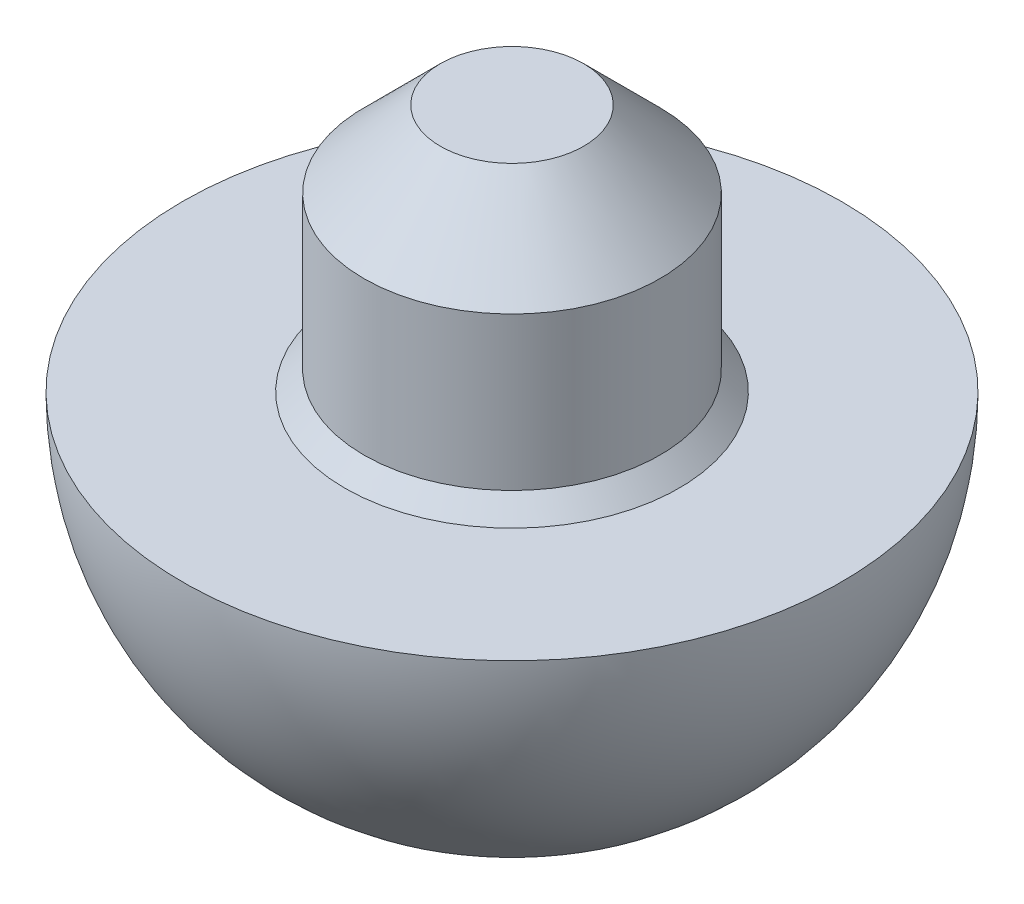
ISO-10303-21;
HEADER;
FILE_DESCRIPTION(('STEP AP214'),'2;1');
FILE_NAME('part.step','',(''),(''),'','','');
FILE_SCHEMA(('AUTOMOTIVE_DESIGN { 1 0 10303 214 1 1 1 1 }'));
ENDSEC;
DATA;
#1=APPLICATION_CONTEXT('core data for automotive mechanical design processes');
#2=APPLICATION_PROTOCOL_DEFINITION('international standard','automotive_design',2000,#1);
#3=PRODUCT_CONTEXT('',#1,'mechanical');
#4=PRODUCT('Part','Part','',(#3));
#5=PRODUCT_RELATED_PRODUCT_CATEGORY('part','',(#4));
#6=PRODUCT_DEFINITION_FORMATION('','',#4);
#7=PRODUCT_DEFINITION_CONTEXT('part definition',#1,'design');
#8=PRODUCT_DEFINITION('design','',#6,#7);
#9=PRODUCT_DEFINITION_SHAPE('','',#8);
#10=(LENGTH_UNIT() NAMED_UNIT(*) SI_UNIT(.MILLI.,.METRE.));
#11=(NAMED_UNIT(*) PLANE_ANGLE_UNIT() SI_UNIT($,.RADIAN.));
#12=(NAMED_UNIT(*) SI_UNIT($,.STERADIAN.) SOLID_ANGLE_UNIT());
#13=UNCERTAINTY_MEASURE_WITH_UNIT(LENGTH_MEASURE(1.E-05),#10,'distance_accuracy_value','');
#14=(GEOMETRIC_REPRESENTATION_CONTEXT(3) GLOBAL_UNCERTAINTY_ASSIGNED_CONTEXT((#13)) GLOBAL_UNIT_ASSIGNED_CONTEXT((#10,
#11,#12)) REPRESENTATION_CONTEXT('',''));
#15=CARTESIAN_POINT('',(0.,0.,0.));
#16=DIRECTION('',(0.,0.,1.));
#17=DIRECTION('',(1.,0.,0.));
#18=AXIS2_PLACEMENT_3D('',#15,#16,#17);
#19=CARTESIAN_POINT('',(0.,16.75,0.));
#20=DIRECTION('',(0.,-1.,0.));
#21=DIRECTION('',(0.,0.,-1.));
#22=AXIS2_PLACEMENT_3D('',#19,#20,#21);
#23=CONICAL_SURFACE('',#22,0.,0.78539816339745);
#24=CARTESIAN_POINT('',(0.,13.,0.));
#25=DIRECTION('',(0.,1.,0.));
#26=DIRECTION('',(-1.,0.,0.));
#27=AXIS2_PLACEMENT_3D('',#24,#25,#26);
#28=CIRCLE('',#27,3.75000000000004);
#29=CARTESIAN_POINT('',(-3.75000000000004,13.,0.));
#30=VERTEX_POINT('',#29);
#31=EDGE_CURVE('E42',#30,#30,#28,.T.);
#32=ORIENTED_EDGE('',*,*,#31,.F.);
#33=EDGE_LOOP('',(#32));
#34=FACE_BOUND('',#33,.T.);
#35=CARTESIAN_POINT('',(0.,9.,0.));
#36=DIRECTION('',(0.,-1.,0.));
#37=DIRECTION('',(0.,0.,-1.));
#38=AXIS2_PLACEMENT_3D('',#35,#36,#37);
#39=CIRCLE('',#38,7.75);
#40=CARTESIAN_POINT('',(0.,9.,-7.75));
#41=VERTEX_POINT('',#40);
#42=EDGE_CURVE('E30',#41,#41,#39,.T.);
#43=ORIENTED_EDGE('',*,*,#42,.F.);
#44=EDGE_LOOP('',(#43));
#45=FACE_BOUND('',#44,.T.);
#46=ADVANCED_FACE('F15',(#34,#45),#23,.T.);
#47=CARTESIAN_POINT('',(0.,0.,0.));
#48=DIRECTION('',(0.,-1.,0.));
#49=DIRECTION('',(0.,0.,-1.));
#50=AXIS2_PLACEMENT_3D('',#47,#48,#49);
#51=CYLINDRICAL_SURFACE('',#50,7.75);
#52=CARTESIAN_POINT('',(0.,1.,0.));
#53=DIRECTION('',(0.,-1.,0.));
#54=DIRECTION('',(0.,0.,-1.));
#55=AXIS2_PLACEMENT_3D('',#52,#53,#54);
#56=CIRCLE('',#55,7.75);
#57=CARTESIAN_POINT('',(0.,1.,-7.75));
#58=VERTEX_POINT('',#57);
#59=EDGE_CURVE('E10',#58,#58,#56,.F.);
#60=ORIENTED_EDGE('',*,*,#59,.T.);
#61=EDGE_LOOP('',(#60));
#62=FACE_BOUND('',#61,.T.);
#63=ORIENTED_EDGE('',*,*,#42,.T.);
#64=EDGE_LOOP('',(#63));
#65=FACE_BOUND('',#64,.T.);
#66=ADVANCED_FACE('F69',(#62,#65),#51,.T.);
#67=CARTESIAN_POINT('',(-7.75,0.,0.));
#68=DIRECTION('',(0.,-1.,0.));
#69=DIRECTION('',(0.,0.,-1.));
#70=AXIS2_PLACEMENT_3D('',#67,#68,#69);
#71=PLANE('',#70);
#72=CARTESIAN_POINT('',(0.,0.,0.));
#73=DIRECTION('',(0.,-1.,0.));
#74=DIRECTION('',(0.,0.,-1.));
#75=AXIS2_PLACEMENT_3D('',#72,#73,#74);
#76=CIRCLE('',#75,8.75);
#77=CARTESIAN_POINT('',(0.,0.,-8.75));
#78=VERTEX_POINT('',#77);
#79=EDGE_CURVE('E23',#78,#78,#76,.T.);
#80=ORIENTED_EDGE('',*,*,#79,.T.);
#81=EDGE_LOOP('',(#80));
#82=FACE_BOUND('',#81,.T.);
#83=CARTESIAN_POINT('',(0.,0.,0.));
#84=DIRECTION('',(0.,-1.,0.));
#85=DIRECTION('',(0.,0.,-1.));
#86=AXIS2_PLACEMENT_3D('',#83,#84,#85);
#87=CIRCLE('',#86,17.25);
#88=CARTESIAN_POINT('',(0.,0.,-17.25));
#89=VERTEX_POINT('',#88);
#90=EDGE_CURVE('E36',#89,#89,#87,.T.);
#91=ORIENTED_EDGE('',*,*,#90,.F.);
#92=EDGE_LOOP('',(#91));
#93=FACE_BOUND('',#92,.T.);
#94=ADVANCED_FACE('F74',(#82,#93),#71,.F.);
#95=CARTESIAN_POINT('',(0.,0.,0.));
#96=DIRECTION('',(0.,-1.,0.));
#97=DIRECTION('',(-1.,0.,0.));
#98=AXIS2_PLACEMENT_3D('',#95,#96,#97);
#99=SPHERICAL_SURFACE('',#98,17.25);
#100=CARTESIAN_POINT('',(0.,-16.5,0.));
#101=DIRECTION('',(0.,1.,0.));
#102=DIRECTION('',(-1.,0.,0.));
#103=AXIS2_PLACEMENT_3D('',#100,#101,#102);
#104=CIRCLE('',#103,5.03115294937453);
#105=CARTESIAN_POINT('',(-5.03115294937453,-16.5,0.));
#106=VERTEX_POINT('',#105);
#107=EDGE_CURVE('E46',#106,#106,#104,.T.);
#108=ORIENTED_EDGE('',*,*,#107,.T.);
#109=EDGE_LOOP('',(#108));
#110=FACE_BOUND('',#109,.T.);
#111=ORIENTED_EDGE('',*,*,#90,.T.);
#112=EDGE_LOOP('',(#111));
#113=FACE_BOUND('',#112,.T.);
#114=ADVANCED_FACE('F53',(#110,#113),#99,.T.);
#115=CARTESIAN_POINT('',(0.,13.,0.));
#116=DIRECTION('',(0.,-1.,0.));
#117=DIRECTION('',(1.,0.,0.));
#118=AXIS2_PLACEMENT_3D('',#115,#116,#117);
#119=PLANE('',#118);
#120=ORIENTED_EDGE('',*,*,#31,.T.);
#121=EDGE_LOOP('',(#120));
#122=FACE_BOUND('',#121,.T.);
#123=ADVANCED_FACE('F58',(#122),#119,.F.);
#124=CARTESIAN_POINT('',(0.,-16.5,0.));
#125=DIRECTION('',(0.,1.,0.));
#126=DIRECTION('',(-1.,0.,0.));
#127=AXIS2_PLACEMENT_3D('',#124,#125,#126);
#128=PLANE('',#127);
#129=ORIENTED_EDGE('',*,*,#107,.F.);
#130=EDGE_LOOP('',(#129));
#131=FACE_BOUND('',#130,.T.);
#132=ADVANCED_FACE('F56',(#131),#128,.F.);
#133=CARTESIAN_POINT('',(0.,0.,0.));
#134=DIRECTION('',(0.,-1.,0.));
#135=DIRECTION('',(0.,0.,-1.));
#136=AXIS2_PLACEMENT_3D('',#133,#134,#135);
#137=CONICAL_SURFACE('',#136,8.75,0.785398163397453);
#138=ORIENTED_EDGE('',*,*,#59,.F.);
#139=EDGE_LOOP('',(#138));
#140=FACE_BOUND('',#139,.T.);
#141=ORIENTED_EDGE('',*,*,#79,.F.);
#142=EDGE_LOOP('',(#141));
#143=FACE_BOUND('',#142,.T.);
#144=ADVANCED_FACE('F17',(#140,#143),#137,.T.);
#145=CLOSED_SHELL('',(#46,#66,#94,#114,#123,#132,#144));
#146=MANIFOLD_SOLID_BREP('B1',#145);
#147=ADVANCED_BREP_SHAPE_REPRESENTATION('',(#18,#146),#14);
#148=SHAPE_DEFINITION_REPRESENTATION(#9,#147);
ENDSEC;
END-ISO-10303-21;
